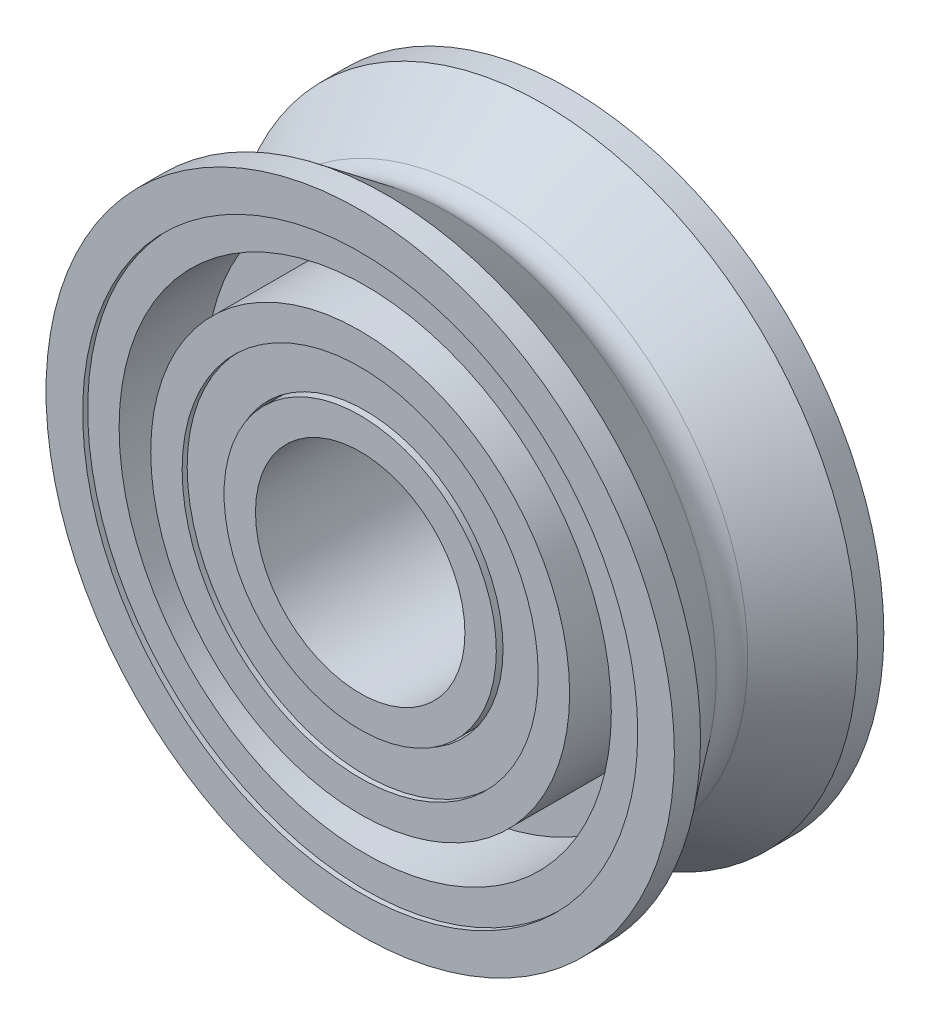
ISO-10303-21;
HEADER;
FILE_DESCRIPTION(('STEP AP214'),'2;1');
FILE_NAME('part.step','',(''),(''),'','','');
FILE_SCHEMA(('AUTOMOTIVE_DESIGN { 1 0 10303 214 1 1 1 1 }'));
ENDSEC;
DATA;
#1=APPLICATION_CONTEXT('core data for automotive mechanical design processes');
#2=APPLICATION_PROTOCOL_DEFINITION('international standard','automotive_design',2000,#1);
#3=PRODUCT_CONTEXT('',#1,'mechanical');
#4=PRODUCT('Part','Part','',(#3));
#5=PRODUCT_RELATED_PRODUCT_CATEGORY('part','',(#4));
#6=PRODUCT_DEFINITION_FORMATION('','',#4);
#7=PRODUCT_DEFINITION_CONTEXT('part definition',#1,'design');
#8=PRODUCT_DEFINITION('design','',#6,#7);
#9=PRODUCT_DEFINITION_SHAPE('','',#8);
#10=(LENGTH_UNIT() NAMED_UNIT(*) SI_UNIT(.MILLI.,.METRE.));
#11=(NAMED_UNIT(*) PLANE_ANGLE_UNIT() SI_UNIT($,.RADIAN.));
#12=(NAMED_UNIT(*) SI_UNIT($,.STERADIAN.) SOLID_ANGLE_UNIT());
#13=UNCERTAINTY_MEASURE_WITH_UNIT(LENGTH_MEASURE(1.E-05),#10,'distance_accuracy_value','');
#14=(GEOMETRIC_REPRESENTATION_CONTEXT(3) GLOBAL_UNCERTAINTY_ASSIGNED_CONTEXT((#13)) GLOBAL_UNIT_ASSIGNED_CONTEXT((#10,
#11,#12)) REPRESENTATION_CONTEXT('',''));
#15=CARTESIAN_POINT('',(0.,0.,0.));
#16=DIRECTION('',(0.,0.,1.));
#17=DIRECTION('',(1.,0.,0.));
#18=AXIS2_PLACEMENT_3D('',#15,#16,#17);
#19=CARTESIAN_POINT('',(0.,0.,0.));
#20=DIRECTION('',(0.,0.,1.));
#21=DIRECTION('',(1.,0.,0.));
#22=AXIS2_PLACEMENT_3D('',#19,#20,#21);
#23=TOROIDAL_SURFACE('',#22,4.365625,0.396874999999999);
#24=CARTESIAN_POINT('',(0.,0.,0.238125));
#25=DIRECTION('',(0.,0.,1.));
#26=DIRECTION('',(1.,0.,0.));
#27=AXIS2_PLACEMENT_3D('',#24,#25,#26);
#28=CIRCLE('',#27,4.048125);
#29=CARTESIAN_POINT('',(4.048125,0.,0.238125));
#30=VERTEX_POINT('',#29);
#31=EDGE_CURVE('E68',#30,#30,#28,.T.);
#32=ORIENTED_EDGE('',*,*,#31,.F.);
#33=EDGE_LOOP('',(#32));
#34=FACE_BOUND('',#33,.T.);
#35=CARTESIAN_POINT('',(0.,0.,-0.238125));
#36=DIRECTION('',(0.,0.,1.));
#37=DIRECTION('',(1.,0.,0.));
#38=AXIS2_PLACEMENT_3D('',#35,#36,#37);
#39=CIRCLE('',#38,4.048125);
#40=CARTESIAN_POINT('',(4.048125,0.,-0.238125));
#41=VERTEX_POINT('',#40);
#42=EDGE_CURVE('E66',#41,#41,#39,.T.);
#43=ORIENTED_EDGE('',*,*,#42,.T.);
#44=EDGE_LOOP('',(#43));
#45=FACE_BOUND('',#44,.T.);
#46=ADVANCED_FACE('F50',(#34,#45),#23,.F.);
#47=CARTESIAN_POINT('',(0.,0.,0.238125));
#48=DIRECTION('',(0.,0.,1.));
#49=DIRECTION('',(1.,0.,0.));
#50=AXIS2_PLACEMENT_3D('',#47,#48,#49);
#51=CONICAL_SURFACE('',#50,4.048125,0.643501108793284);
#52=CARTESIAN_POINT('',(0.,0.,1.190625));
#53=DIRECTION('',(0.,0.,1.));
#54=DIRECTION('',(1.,0.,0.));
#55=AXIS2_PLACEMENT_3D('',#52,#53,#54);
#56=CIRCLE('',#55,4.7625);
#57=CARTESIAN_POINT('',(4.7625,0.,1.190625));
#58=VERTEX_POINT('',#57);
#59=EDGE_CURVE('E72',#58,#58,#56,.T.);
#60=ORIENTED_EDGE('',*,*,#59,.F.);
#61=EDGE_LOOP('',(#60));
#62=FACE_BOUND('',#61,.T.);
#63=ORIENTED_EDGE('',*,*,#31,.T.);
#64=EDGE_LOOP('',(#63));
#65=FACE_BOUND('',#64,.T.);
#66=ADVANCED_FACE('F188',(#62,#65),#51,.T.);
#67=CARTESIAN_POINT('',(0.,0.,1.5875));
#68=DIRECTION('',(0.,0.,1.));
#69=DIRECTION('',(1.,0.,0.));
#70=AXIS2_PLACEMENT_3D('',#67,#68,#69);
#71=CYLINDRICAL_SURFACE('',#70,4.7625);
#72=CARTESIAN_POINT('',(0.,0.,1.5875));
#73=DIRECTION('',(0.,0.,1.));
#74=DIRECTION('',(1.,0.,0.));
#75=AXIS2_PLACEMENT_3D('',#72,#73,#74);
#76=CIRCLE('',#75,4.7625);
#77=CARTESIAN_POINT('',(4.7625,0.,1.5875));
#78=VERTEX_POINT('',#77);
#79=EDGE_CURVE('E77',#78,#78,#76,.T.);
#80=ORIENTED_EDGE('',*,*,#79,.F.);
#81=EDGE_LOOP('',(#80));
#82=FACE_BOUND('',#81,.T.);
#83=ORIENTED_EDGE('',*,*,#59,.T.);
#84=EDGE_LOOP('',(#83));
#85=FACE_BOUND('',#84,.T.);
#86=ADVANCED_FACE('F194',(#82,#85),#71,.T.);
#87=CARTESIAN_POINT('',(0.,4.206875,1.5875));
#88=DIRECTION('',(0.,0.,-1.));
#89=DIRECTION('',(-1.,0.,0.));
#90=AXIS2_PLACEMENT_3D('',#87,#88,#89);
#91=PLANE('',#90);
#92=CARTESIAN_POINT('',(0.,0.,1.5875));
#93=DIRECTION('',(0.,0.,1.));
#94=DIRECTION('',(1.,0.,0.));
#95=AXIS2_PLACEMENT_3D('',#92,#93,#94);
#96=CIRCLE('',#95,4.206875);
#97=CARTESIAN_POINT('',(4.206875,0.,1.5875));
#98=VERTEX_POINT('',#97);
#99=EDGE_CURVE('E84',#98,#98,#96,.T.);
#100=ORIENTED_EDGE('',*,*,#99,.F.);
#101=EDGE_LOOP('',(#100));
#102=FACE_BOUND('',#101,.T.);
#103=ORIENTED_EDGE('',*,*,#79,.T.);
#104=EDGE_LOOP('',(#103));
#105=FACE_BOUND('',#104,.T.);
#106=ADVANCED_FACE('F200',(#102,#105),#91,.F.);
#107=CARTESIAN_POINT('',(0.,0.,1.5875));
#108=DIRECTION('',(0.,0.,1.));
#109=DIRECTION('',(1.,0.,0.));
#110=AXIS2_PLACEMENT_3D('',#107,#108,#109);
#111=CYLINDRICAL_SURFACE('',#110,4.206875);
#112=CARTESIAN_POINT('',(0.,0.,1.5113));
#113=DIRECTION('',(0.,0.,1.));
#114=DIRECTION('',(1.,0.,0.));
#115=AXIS2_PLACEMENT_3D('',#112,#113,#114);
#116=CIRCLE('',#115,4.206875);
#117=CARTESIAN_POINT('',(4.206875,0.,1.5113));
#118=VERTEX_POINT('',#117);
#119=EDGE_CURVE('E87',#118,#118,#116,.T.);
#120=ORIENTED_EDGE('',*,*,#119,.F.);
#121=EDGE_LOOP('',(#120));
#122=FACE_BOUND('',#121,.T.);
#123=ORIENTED_EDGE('',*,*,#99,.T.);
#124=EDGE_LOOP('',(#123));
#125=FACE_BOUND('',#124,.T.);
#126=ADVANCED_FACE('F204',(#122,#125),#111,.F.);
#127=CARTESIAN_POINT('',(0.,4.206875,1.5113));
#128=DIRECTION('',(0.,0.,-1.));
#129=DIRECTION('',(-1.,0.,0.));
#130=AXIS2_PLACEMENT_3D('',#127,#128,#129);
#131=PLANE('',#130);
#132=CARTESIAN_POINT('',(0.,0.,1.5113));
#133=DIRECTION('',(0.,0.,1.));
#134=DIRECTION('',(1.,0.,0.));
#135=AXIS2_PLACEMENT_3D('',#132,#133,#134);
#136=CIRCLE('',#135,3.730625);
#137=CARTESIAN_POINT('',(3.730625,0.,1.5113));
#138=VERTEX_POINT('',#137);
#139=EDGE_CURVE('E90',#138,#138,#136,.T.);
#140=ORIENTED_EDGE('',*,*,#139,.F.);
#141=EDGE_LOOP('',(#140));
#142=FACE_BOUND('',#141,.T.);
#143=ORIENTED_EDGE('',*,*,#119,.T.);
#144=EDGE_LOOP('',(#143));
#145=FACE_BOUND('',#144,.T.);
#146=ADVANCED_FACE('F208',(#142,#145),#131,.F.);
#147=CARTESIAN_POINT('',(0.,0.,1.5875));
#148=DIRECTION('',(0.,0.,1.));
#149=DIRECTION('',(1.,0.,0.));
#150=AXIS2_PLACEMENT_3D('',#147,#148,#149);
#151=CYLINDRICAL_SURFACE('',#150,3.730625);
#152=CARTESIAN_POINT('',(0.,0.,0.1984375));
#153=DIRECTION('',(0.,0.,1.));
#154=DIRECTION('',(1.,0.,0.));
#155=AXIS2_PLACEMENT_3D('',#152,#153,#154);
#156=CIRCLE('',#155,3.730625);
#157=CARTESIAN_POINT('',(3.730625,0.,0.1984375));
#158=VERTEX_POINT('',#157);
#159=EDGE_CURVE('E93',#158,#158,#156,.T.);
#160=ORIENTED_EDGE('',*,*,#159,.F.);
#161=EDGE_LOOP('',(#160));
#162=FACE_BOUND('',#161,.T.);
#163=ORIENTED_EDGE('',*,*,#139,.T.);
#164=EDGE_LOOP('',(#163));
#165=FACE_BOUND('',#164,.T.);
#166=ADVANCED_FACE('F212',(#162,#165),#151,.F.);
#167=CARTESIAN_POINT('',(0.,3.730625,0.1984375));
#168=DIRECTION('',(0.,0.,-1.));
#169=DIRECTION('',(-1.,0.,0.));
#170=AXIS2_PLACEMENT_3D('',#167,#168,#169);
#171=PLANE('',#170);
#172=CARTESIAN_POINT('',(0.,0.,0.1984375));
#173=DIRECTION('',(0.,0.,1.));
#174=DIRECTION('',(1.,0.,0.));
#175=AXIS2_PLACEMENT_3D('',#172,#173,#174);
#176=CIRCLE('',#175,3.175);
#177=CARTESIAN_POINT('',(3.175,0.,0.1984375));
#178=VERTEX_POINT('',#177);
#179=EDGE_CURVE('E96',#178,#178,#176,.T.);
#180=ORIENTED_EDGE('',*,*,#179,.F.);
#181=EDGE_LOOP('',(#180));
#182=FACE_BOUND('',#181,.T.);
#183=ORIENTED_EDGE('',*,*,#159,.T.);
#184=EDGE_LOOP('',(#183));
#185=FACE_BOUND('',#184,.T.);
#186=ADVANCED_FACE('F216',(#182,#185),#171,.F.);
#187=CARTESIAN_POINT('',(0.,0.,1.5875));
#188=DIRECTION('',(0.,0.,1.));
#189=DIRECTION('',(1.,0.,0.));
#190=AXIS2_PLACEMENT_3D('',#187,#188,#189);
#191=CYLINDRICAL_SURFACE('',#190,3.175);
#192=CARTESIAN_POINT('',(0.,0.,1.5875));
#193=DIRECTION('',(0.,0.,1.));
#194=DIRECTION('',(1.,0.,0.));
#195=AXIS2_PLACEMENT_3D('',#192,#193,#194);
#196=CIRCLE('',#195,3.175);
#197=CARTESIAN_POINT('',(3.175,0.,1.5875));
#198=VERTEX_POINT('',#197);
#199=EDGE_CURVE('E99',#198,#198,#196,.T.);
#200=ORIENTED_EDGE('',*,*,#199,.F.);
#201=EDGE_LOOP('',(#200));
#202=FACE_BOUND('',#201,.T.);
#203=ORIENTED_EDGE('',*,*,#179,.T.);
#204=EDGE_LOOP('',(#203));
#205=FACE_BOUND('',#204,.T.);
#206=ADVANCED_FACE('F220',(#202,#205),#191,.T.);
#207=CARTESIAN_POINT('',(0.,2.69875,1.5875));
#208=DIRECTION('',(0.,0.,-1.));
#209=DIRECTION('',(-1.,0.,0.));
#210=AXIS2_PLACEMENT_3D('',#207,#208,#209);
#211=PLANE('',#210);
#212=CARTESIAN_POINT('',(0.,0.,1.5875));
#213=DIRECTION('',(0.,0.,1.));
#214=DIRECTION('',(1.,0.,0.));
#215=AXIS2_PLACEMENT_3D('',#212,#213,#214);
#216=CIRCLE('',#215,2.69875);
#217=CARTESIAN_POINT('',(2.69875,0.,1.5875));
#218=VERTEX_POINT('',#217);
#219=EDGE_CURVE('E102',#218,#218,#216,.T.);
#220=ORIENTED_EDGE('',*,*,#219,.F.);
#221=EDGE_LOOP('',(#220));
#222=FACE_BOUND('',#221,.T.);
#223=ORIENTED_EDGE('',*,*,#199,.T.);
#224=EDGE_LOOP('',(#223));
#225=FACE_BOUND('',#224,.T.);
#226=ADVANCED_FACE('F224',(#222,#225),#211,.F.);
#227=CARTESIAN_POINT('',(0.,0.,1.5875));
#228=DIRECTION('',(0.,0.,1.));
#229=DIRECTION('',(1.,0.,0.));
#230=AXIS2_PLACEMENT_3D('',#227,#228,#229);
#231=CYLINDRICAL_SURFACE('',#230,2.69875);
#232=CARTESIAN_POINT('',(0.,0.,1.5113));
#233=DIRECTION('',(0.,0.,1.));
#234=DIRECTION('',(1.,0.,0.));
#235=AXIS2_PLACEMENT_3D('',#232,#233,#234);
#236=CIRCLE('',#235,2.69875);
#237=CARTESIAN_POINT('',(2.69875,0.,1.5113));
#238=VERTEX_POINT('',#237);
#239=EDGE_CURVE('E105',#238,#238,#236,.T.);
#240=ORIENTED_EDGE('',*,*,#239,.F.);
#241=EDGE_LOOP('',(#240));
#242=FACE_BOUND('',#241,.T.);
#243=ORIENTED_EDGE('',*,*,#219,.T.);
#244=EDGE_LOOP('',(#243));
#245=FACE_BOUND('',#244,.T.);
#246=ADVANCED_FACE('F183',(#242,#245),#231,.F.);
#247=CARTESIAN_POINT('',(0.,2.06375,1.5113));
#248=DIRECTION('',(0.,0.,-1.));
#249=DIRECTION('',(-1.,0.,0.));
#250=AXIS2_PLACEMENT_3D('',#247,#248,#249);
#251=PLANE('',#250);
#252=CARTESIAN_POINT('',(0.,0.,1.5113));
#253=DIRECTION('',(0.,0.,-1.));
#254=DIRECTION('',(-1.,0.,0.));
#255=AXIS2_PLACEMENT_3D('',#252,#253,#254);
#256=CIRCLE('',#255,2.08915);
#257=CARTESIAN_POINT('',(-2.08915,0.,1.5113));
#258=VERTEX_POINT('',#257);
#259=EDGE_CURVE('E54',#258,#258,#256,.T.);
#260=ORIENTED_EDGE('',*,*,#259,.T.);
#261=EDGE_LOOP('',(#260));
#262=FACE_BOUND('',#261,.T.);
#263=ORIENTED_EDGE('',*,*,#239,.T.);
#264=EDGE_LOOP('',(#263));
#265=FACE_BOUND('',#264,.T.);
#266=ADVANCED_FACE('F177',(#262,#265),#251,.F.);
#267=CARTESIAN_POINT('',(0.,2.69875,-1.5113));
#268=DIRECTION('',(0.,0.,1.));
#269=DIRECTION('',(1.,0.,0.));
#270=AXIS2_PLACEMENT_3D('',#267,#268,#269);
#271=PLANE('',#270);
#272=CARTESIAN_POINT('',(0.,0.,-1.5113));
#273=DIRECTION('',(0.,0.,1.));
#274=DIRECTION('',(1.,0.,0.));
#275=AXIS2_PLACEMENT_3D('',#272,#273,#274);
#276=CIRCLE('',#275,2.08915);
#277=CARTESIAN_POINT('',(2.08915,0.,-1.5113));
#278=VERTEX_POINT('',#277);
#279=EDGE_CURVE('E80',#278,#278,#276,.T.);
#280=ORIENTED_EDGE('',*,*,#279,.T.);
#281=EDGE_LOOP('',(#280));
#282=FACE_BOUND('',#281,.T.);
#283=CARTESIAN_POINT('',(0.,0.,-1.5113));
#284=DIRECTION('',(0.,0.,1.));
#285=DIRECTION('',(1.,0.,0.));
#286=AXIS2_PLACEMENT_3D('',#283,#284,#285);
#287=CIRCLE('',#286,2.69875);
#288=CARTESIAN_POINT('',(2.69875,0.,-1.5113));
#289=VERTEX_POINT('',#288);
#290=EDGE_CURVE('E108',#289,#289,#287,.T.);
#291=ORIENTED_EDGE('',*,*,#290,.F.);
#292=EDGE_LOOP('',(#291));
#293=FACE_BOUND('',#292,.T.);
#294=ADVANCED_FACE('F172',(#282,#293),#271,.F.);
#295=CARTESIAN_POINT('',(0.,0.,1.5875));
#296=DIRECTION('',(0.,0.,1.));
#297=DIRECTION('',(1.,0.,0.));
#298=AXIS2_PLACEMENT_3D('',#295,#296,#297);
#299=CYLINDRICAL_SURFACE('',#298,2.69875);
#300=CARTESIAN_POINT('',(0.,0.,-1.5875));
#301=DIRECTION('',(0.,0.,1.));
#302=DIRECTION('',(1.,0.,0.));
#303=AXIS2_PLACEMENT_3D('',#300,#301,#302);
#304=CIRCLE('',#303,2.69875);
#305=CARTESIAN_POINT('',(2.69875,0.,-1.5875));
#306=VERTEX_POINT('',#305);
#307=EDGE_CURVE('E111',#306,#306,#304,.T.);
#308=ORIENTED_EDGE('',*,*,#307,.F.);
#309=EDGE_LOOP('',(#308));
#310=FACE_BOUND('',#309,.T.);
#311=ORIENTED_EDGE('',*,*,#290,.T.);
#312=EDGE_LOOP('',(#311));
#313=FACE_BOUND('',#312,.T.);
#314=ADVANCED_FACE('F166',(#310,#313),#299,.F.);
#315=CARTESIAN_POINT('',(0.,3.175,-1.5875));
#316=DIRECTION('',(0.,0.,1.));
#317=DIRECTION('',(1.,0.,0.));
#318=AXIS2_PLACEMENT_3D('',#315,#316,#317);
#319=PLANE('',#318);
#320=CARTESIAN_POINT('',(0.,0.,-1.5875));
#321=DIRECTION('',(0.,0.,1.));
#322=DIRECTION('',(1.,0.,0.));
#323=AXIS2_PLACEMENT_3D('',#320,#321,#322);
#324=CIRCLE('',#323,3.175);
#325=CARTESIAN_POINT('',(3.175,0.,-1.5875));
#326=VERTEX_POINT('',#325);
#327=EDGE_CURVE('E114',#326,#326,#324,.T.);
#328=ORIENTED_EDGE('',*,*,#327,.F.);
#329=EDGE_LOOP('',(#328));
#330=FACE_BOUND('',#329,.T.);
#331=ORIENTED_EDGE('',*,*,#307,.T.);
#332=EDGE_LOOP('',(#331));
#333=FACE_BOUND('',#332,.T.);
#334=ADVANCED_FACE('F160',(#330,#333),#319,.F.);
#335=CARTESIAN_POINT('',(0.,0.,1.5875));
#336=DIRECTION('',(0.,0.,1.));
#337=DIRECTION('',(1.,0.,0.));
#338=AXIS2_PLACEMENT_3D('',#335,#336,#337);
#339=CYLINDRICAL_SURFACE('',#338,3.175);
#340=CARTESIAN_POINT('',(0.,0.,-0.1984375));
#341=DIRECTION('',(0.,0.,1.));
#342=DIRECTION('',(1.,0.,0.));
#343=AXIS2_PLACEMENT_3D('',#340,#341,#342);
#344=CIRCLE('',#343,3.175);
#345=CARTESIAN_POINT('',(3.175,0.,-0.1984375));
#346=VERTEX_POINT('',#345);
#347=EDGE_CURVE('E117',#346,#346,#344,.T.);
#348=ORIENTED_EDGE('',*,*,#347,.F.);
#349=EDGE_LOOP('',(#348));
#350=FACE_BOUND('',#349,.T.);
#351=ORIENTED_EDGE('',*,*,#327,.T.);
#352=EDGE_LOOP('',(#351));
#353=FACE_BOUND('',#352,.T.);
#354=ADVANCED_FACE('F154',(#350,#353),#339,.T.);
#355=CARTESIAN_POINT('',(0.,3.730625,-0.1984375));
#356=DIRECTION('',(0.,0.,1.));
#357=DIRECTION('',(1.,0.,0.));
#358=AXIS2_PLACEMENT_3D('',#355,#356,#357);
#359=PLANE('',#358);
#360=CARTESIAN_POINT('',(0.,0.,-0.1984375));
#361=DIRECTION('',(0.,0.,1.));
#362=DIRECTION('',(1.,0.,0.));
#363=AXIS2_PLACEMENT_3D('',#360,#361,#362);
#364=CIRCLE('',#363,3.730625);
#365=CARTESIAN_POINT('',(3.730625,0.,-0.1984375));
#366=VERTEX_POINT('',#365);
#367=EDGE_CURVE('E120',#366,#366,#364,.T.);
#368=ORIENTED_EDGE('',*,*,#367,.F.);
#369=EDGE_LOOP('',(#368));
#370=FACE_BOUND('',#369,.T.);
#371=ORIENTED_EDGE('',*,*,#347,.T.);
#372=EDGE_LOOP('',(#371));
#373=FACE_BOUND('',#372,.T.);
#374=ADVANCED_FACE('F148',(#370,#373),#359,.F.);
#375=CARTESIAN_POINT('',(0.,0.,1.5875));
#376=DIRECTION('',(0.,0.,1.));
#377=DIRECTION('',(1.,0.,0.));
#378=AXIS2_PLACEMENT_3D('',#375,#376,#377);
#379=CYLINDRICAL_SURFACE('',#378,3.730625);
#380=CARTESIAN_POINT('',(0.,0.,-1.5113));
#381=DIRECTION('',(0.,0.,1.));
#382=DIRECTION('',(1.,0.,0.));
#383=AXIS2_PLACEMENT_3D('',#380,#381,#382);
#384=CIRCLE('',#383,3.730625);
#385=CARTESIAN_POINT('',(3.730625,0.,-1.5113));
#386=VERTEX_POINT('',#385);
#387=EDGE_CURVE('E123',#386,#386,#384,.T.);
#388=ORIENTED_EDGE('',*,*,#387,.F.);
#389=EDGE_LOOP('',(#388));
#390=FACE_BOUND('',#389,.T.);
#391=ORIENTED_EDGE('',*,*,#367,.T.);
#392=EDGE_LOOP('',(#391));
#393=FACE_BOUND('',#392,.T.);
#394=ADVANCED_FACE('F142',(#390,#393),#379,.F.);
#395=CARTESIAN_POINT('',(0.,4.206875,-1.5113));
#396=DIRECTION('',(0.,0.,1.));
#397=DIRECTION('',(1.,0.,0.));
#398=AXIS2_PLACEMENT_3D('',#395,#396,#397);
#399=PLANE('',#398);
#400=CARTESIAN_POINT('',(0.,0.,-1.5113));
#401=DIRECTION('',(0.,0.,1.));
#402=DIRECTION('',(1.,0.,0.));
#403=AXIS2_PLACEMENT_3D('',#400,#401,#402);
#404=CIRCLE('',#403,4.206875);
#405=CARTESIAN_POINT('',(4.206875,0.,-1.5113));
#406=VERTEX_POINT('',#405);
#407=EDGE_CURVE('E126',#406,#406,#404,.T.);
#408=ORIENTED_EDGE('',*,*,#407,.F.);
#409=EDGE_LOOP('',(#408));
#410=FACE_BOUND('',#409,.T.);
#411=ORIENTED_EDGE('',*,*,#387,.T.);
#412=EDGE_LOOP('',(#411));
#413=FACE_BOUND('',#412,.T.);
#414=ADVANCED_FACE('F136',(#410,#413),#399,.F.);
#415=CARTESIAN_POINT('',(0.,0.,1.5875));
#416=DIRECTION('',(0.,0.,1.));
#417=DIRECTION('',(1.,0.,0.));
#418=AXIS2_PLACEMENT_3D('',#415,#416,#417);
#419=CYLINDRICAL_SURFACE('',#418,4.206875);
#420=CARTESIAN_POINT('',(0.,0.,-1.5875));
#421=DIRECTION('',(0.,0.,1.));
#422=DIRECTION('',(1.,0.,0.));
#423=AXIS2_PLACEMENT_3D('',#420,#421,#422);
#424=CIRCLE('',#423,4.206875);
#425=CARTESIAN_POINT('',(4.206875,0.,-1.5875));
#426=VERTEX_POINT('',#425);
#427=EDGE_CURVE('E63',#426,#426,#424,.T.);
#428=ORIENTED_EDGE('',*,*,#427,.F.);
#429=EDGE_LOOP('',(#428));
#430=FACE_BOUND('',#429,.T.);
#431=ORIENTED_EDGE('',*,*,#407,.T.);
#432=EDGE_LOOP('',(#431));
#433=FACE_BOUND('',#432,.T.);
#434=ADVANCED_FACE('F133',(#430,#433),#419,.F.);
#435=CARTESIAN_POINT('',(0.,4.7625,-1.5875));
#436=DIRECTION('',(0.,0.,1.));
#437=DIRECTION('',(1.,0.,0.));
#438=AXIS2_PLACEMENT_3D('',#435,#436,#437);
#439=PLANE('',#438);
#440=CARTESIAN_POINT('',(0.,0.,-1.5875));
#441=DIRECTION('',(0.,0.,1.));
#442=DIRECTION('',(1.,0.,0.));
#443=AXIS2_PLACEMENT_3D('',#440,#441,#442);
#444=CIRCLE('',#443,4.7625);
#445=CARTESIAN_POINT('',(4.7625,0.,-1.5875));
#446=VERTEX_POINT('',#445);
#447=EDGE_CURVE('E58',#446,#446,#444,.T.);
#448=ORIENTED_EDGE('',*,*,#447,.F.);
#449=EDGE_LOOP('',(#448));
#450=FACE_BOUND('',#449,.T.);
#451=ORIENTED_EDGE('',*,*,#427,.T.);
#452=EDGE_LOOP('',(#451));
#453=FACE_BOUND('',#452,.T.);
#454=ADVANCED_FACE('F131',(#450,#453),#439,.F.);
#455=CARTESIAN_POINT('',(0.,0.,1.5875));
#456=DIRECTION('',(0.,0.,1.));
#457=DIRECTION('',(1.,0.,0.));
#458=AXIS2_PLACEMENT_3D('',#455,#456,#457);
#459=CYLINDRICAL_SURFACE('',#458,4.7625);
#460=CARTESIAN_POINT('',(0.,0.,-1.190625));
#461=DIRECTION('',(0.,0.,1.));
#462=DIRECTION('',(1.,0.,0.));
#463=AXIS2_PLACEMENT_3D('',#460,#461,#462);
#464=CIRCLE('',#463,4.7625);
#465=CARTESIAN_POINT('',(4.7625,0.,-1.190625));
#466=VERTEX_POINT('',#465);
#467=EDGE_CURVE('E12',#466,#466,#464,.T.);
#468=ORIENTED_EDGE('',*,*,#467,.F.);
#469=EDGE_LOOP('',(#468));
#470=FACE_BOUND('',#469,.T.);
#471=ORIENTED_EDGE('',*,*,#447,.T.);
#472=EDGE_LOOP('',(#471));
#473=FACE_BOUND('',#472,.T.);
#474=ADVANCED_FACE('F314',(#470,#473),#459,.T.);
#475=CARTESIAN_POINT('',(0.,0.,-1.190625));
#476=DIRECTION('',(0.,0.,-1.));
#477=DIRECTION('',(-1.,0.,0.));
#478=AXIS2_PLACEMENT_3D('',#475,#476,#477);
#479=CONICAL_SURFACE('',#478,4.7625,0.643501108793284);
#480=ORIENTED_EDGE('',*,*,#42,.F.);
#481=EDGE_LOOP('',(#480));
#482=FACE_BOUND('',#481,.T.);
#483=ORIENTED_EDGE('',*,*,#467,.T.);
#484=EDGE_LOOP('',(#483));
#485=FACE_BOUND('',#484,.T.);
#486=ADVANCED_FACE('F324',(#482,#485),#479,.T.);
#487=CARTESIAN_POINT('',(0.,0.,-1.5875));
#488=DIRECTION('',(0.,0.,1.));
#489=DIRECTION('',(1.,0.,0.));
#490=AXIS2_PLACEMENT_3D('',#487,#488,#489);
#491=CYLINDRICAL_SURFACE('',#490,2.08915);
#492=ORIENTED_EDGE('',*,*,#279,.F.);
#493=EDGE_LOOP('',(#492));
#494=FACE_BOUND('',#493,.T.);
#495=ORIENTED_EDGE('',*,*,#259,.F.);
#496=EDGE_LOOP('',(#495));
#497=FACE_BOUND('',#496,.T.);
#498=ADVANCED_FACE('F52',(#494,#497),#491,.F.);
#499=CLOSED_SHELL('',(#46,#66,#86,#106,#126,#146,#166,#186,#206,#226,#246,#266,#294,#314,#334,
#354,#374,#394,#414,#434,#454,#474,#486,#498));
#500=MANIFOLD_SOLID_BREP('B2',#499);
#501=CARTESIAN_POINT('',(0.,2.06375,1.5875));
#502=DIRECTION('',(0.,0.,-1.));
#503=DIRECTION('',(-1.,0.,0.));
#504=AXIS2_PLACEMENT_3D('',#501,#502,#503);
#505=PLANE('',#504);
#506=CARTESIAN_POINT('',(0.,0.,1.5875));
#507=DIRECTION('',(0.,0.,1.));
#508=DIRECTION('',(1.,0.,0.));
#509=AXIS2_PLACEMENT_3D('',#506,#507,#508);
#510=CIRCLE('',#509,1.5875);
#511=CARTESIAN_POINT('',(1.5875,0.,1.5875));
#512=VERTEX_POINT('',#511);
#513=EDGE_CURVE('E417',#512,#512,#510,.T.);
#514=ORIENTED_EDGE('',*,*,#513,.F.);
#515=EDGE_LOOP('',(#514));
#516=FACE_BOUND('',#515,.T.);
#517=CARTESIAN_POINT('',(0.,0.,1.5875));
#518=DIRECTION('',(0.,0.,1.));
#519=DIRECTION('',(1.,0.,0.));
#520=AXIS2_PLACEMENT_3D('',#517,#518,#519);
#521=CIRCLE('',#520,2.06375);
#522=CARTESIAN_POINT('',(2.06375,0.,1.5875));
#523=VERTEX_POINT('',#522);
#524=EDGE_CURVE('E49',#523,#523,#521,.T.);
#525=ORIENTED_EDGE('',*,*,#524,.T.);
#526=EDGE_LOOP('',(#525));
#527=FACE_BOUND('',#526,.T.);
#528=ADVANCED_FACE('F411',(#516,#527),#505,.F.);
#529=CARTESIAN_POINT('',(0.,0.,1.5875));
#530=DIRECTION('',(0.,0.,1.));
#531=DIRECTION('',(1.,0.,0.));
#532=AXIS2_PLACEMENT_3D('',#529,#530,#531);
#533=CYLINDRICAL_SURFACE('',#532,1.5875);
#534=CARTESIAN_POINT('',(0.,0.,-1.5875));
#535=DIRECTION('',(0.,0.,1.));
#536=DIRECTION('',(1.,0.,0.));
#537=AXIS2_PLACEMENT_3D('',#534,#535,#536);
#538=CIRCLE('',#537,1.5875);
#539=CARTESIAN_POINT('',(1.5875,0.,-1.5875));
#540=VERTEX_POINT('',#539);
#541=EDGE_CURVE('E421',#540,#540,#538,.T.);
#542=ORIENTED_EDGE('',*,*,#541,.F.);
#543=EDGE_LOOP('',(#542));
#544=FACE_BOUND('',#543,.T.);
#545=ORIENTED_EDGE('',*,*,#513,.T.);
#546=EDGE_LOOP('',(#545));
#547=FACE_BOUND('',#546,.T.);
#548=ADVANCED_FACE('F437',(#544,#547),#533,.F.);
#549=CARTESIAN_POINT('',(0.,2.06375,-1.5875));
#550=DIRECTION('',(0.,0.,1.));
#551=DIRECTION('',(1.,0.,0.));
#552=AXIS2_PLACEMENT_3D('',#549,#550,#551);
#553=PLANE('',#552);
#554=CARTESIAN_POINT('',(0.,0.,-1.5875));
#555=DIRECTION('',(0.,0.,1.));
#556=DIRECTION('',(1.,0.,0.));
#557=AXIS2_PLACEMENT_3D('',#554,#555,#556);
#558=CIRCLE('',#557,2.06375);
#559=CARTESIAN_POINT('',(2.06375,0.,-1.5875));
#560=VERTEX_POINT('',#559);
#561=EDGE_CURVE('E425',#560,#560,#558,.T.);
#562=ORIENTED_EDGE('',*,*,#561,.F.);
#563=EDGE_LOOP('',(#562));
#564=FACE_BOUND('',#563,.T.);
#565=ORIENTED_EDGE('',*,*,#541,.T.);
#566=EDGE_LOOP('',(#565));
#567=FACE_BOUND('',#566,.T.);
#568=ADVANCED_FACE('F434',(#564,#567),#553,.F.);
#569=CARTESIAN_POINT('',(0.,0.,1.5875));
#570=DIRECTION('',(0.,0.,1.));
#571=DIRECTION('',(1.,0.,0.));
#572=AXIS2_PLACEMENT_3D('',#569,#570,#571);
#573=CYLINDRICAL_SURFACE('',#572,2.06375);
#574=ORIENTED_EDGE('',*,*,#561,.T.);
#575=EDGE_LOOP('',(#574));
#576=FACE_BOUND('',#575,.T.);
#577=ORIENTED_EDGE('',*,*,#524,.F.);
#578=EDGE_LOOP('',(#577));
#579=FACE_BOUND('',#578,.T.);
#580=ADVANCED_FACE('F431',(#576,#579),#573,.T.);
#581=CLOSED_SHELL('',(#528,#548,#568,#580));
#582=MANIFOLD_SOLID_BREP('B7',#581);
#583=ADVANCED_BREP_SHAPE_REPRESENTATION('',(#18,#500,#582),#14);
#584=SHAPE_DEFINITION_REPRESENTATION(#9,#583);
ENDSEC;
END-ISO-10303-21;
